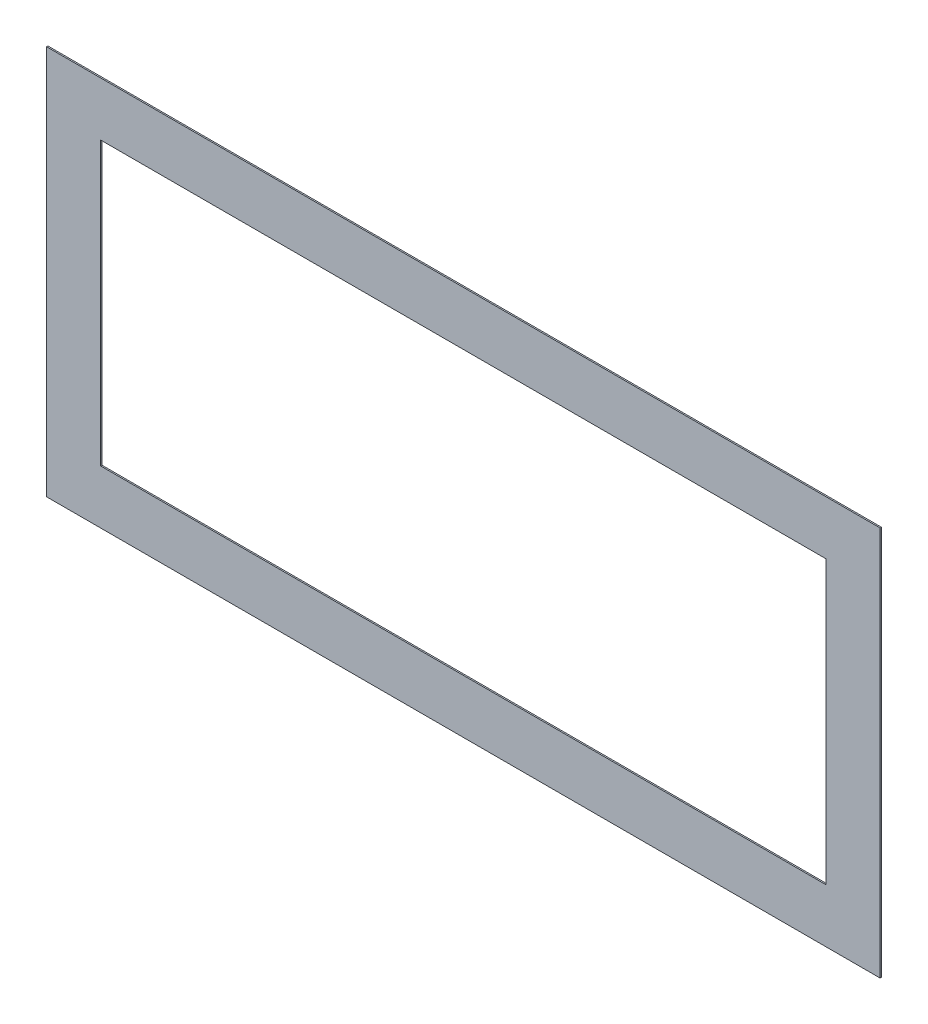
ISO-10303-21;
HEADER;
FILE_DESCRIPTION(('STEP AP214'),'2;1');
FILE_NAME('part.step','',(''),(''),'','','');
FILE_SCHEMA(('AUTOMOTIVE_DESIGN { 1 0 10303 214 1 1 1 1 }'));
ENDSEC;
DATA;
#1=APPLICATION_CONTEXT('core data for automotive mechanical design processes');
#2=APPLICATION_PROTOCOL_DEFINITION('international standard','automotive_design',2000,#1);
#3=PRODUCT_CONTEXT('',#1,'mechanical');
#4=PRODUCT('Part','Part','',(#3));
#5=PRODUCT_RELATED_PRODUCT_CATEGORY('part','',(#4));
#6=PRODUCT_DEFINITION_FORMATION('','',#4);
#7=PRODUCT_DEFINITION_CONTEXT('part definition',#1,'design');
#8=PRODUCT_DEFINITION('design','',#6,#7);
#9=PRODUCT_DEFINITION_SHAPE('','',#8);
#10=(LENGTH_UNIT() NAMED_UNIT(*) SI_UNIT(.MILLI.,.METRE.));
#11=(NAMED_UNIT(*) PLANE_ANGLE_UNIT() SI_UNIT($,.RADIAN.));
#12=(NAMED_UNIT(*) SI_UNIT($,.STERADIAN.) SOLID_ANGLE_UNIT());
#13=UNCERTAINTY_MEASURE_WITH_UNIT(LENGTH_MEASURE(1.E-05),#10,'distance_accuracy_value','');
#14=(GEOMETRIC_REPRESENTATION_CONTEXT(3) GLOBAL_UNCERTAINTY_ASSIGNED_CONTEXT((#13)) GLOBAL_UNIT_ASSIGNED_CONTEXT((#10,
#11,#12)) REPRESENTATION_CONTEXT('',''));
#15=CARTESIAN_POINT('',(0.,0.,0.));
#16=DIRECTION('',(0.,0.,1.));
#17=DIRECTION('',(1.,0.,0.));
#18=AXIS2_PLACEMENT_3D('',#15,#16,#17);
#19=CARTESIAN_POINT('',(-685.8,266.7,0.));
#20=DIRECTION('',(-1.,0.,0.));
#21=DIRECTION('',(0.,0.,1.));
#22=AXIS2_PLACEMENT_3D('',#19,#20,#21);
#23=PLANE('',#22);
#24=DIRECTION('',(0.,-1.,0.));
#25=VECTOR('',#24,1.);
#26=CARTESIAN_POINT('',(-685.8,266.7,0.));
#27=LINE('',#26,#25);
#28=CARTESIAN_POINT('',(-685.8,266.7,0.));
#29=VERTEX_POINT('',#28);
#30=CARTESIAN_POINT('',(-685.8,-266.7,0.));
#31=VERTEX_POINT('',#30);
#32=EDGE_CURVE('E34',#29,#31,#27,.T.);
#33=ORIENTED_EDGE('',*,*,#32,.F.);
#34=DIRECTION('',(0.,0.,1.));
#35=VECTOR('',#34,1.);
#36=CARTESIAN_POINT('',(-685.8,266.7,0.));
#37=LINE('',#36,#35);
#38=CARTESIAN_POINT('',(-685.8,266.7,2.54));
#39=VERTEX_POINT('',#38);
#40=EDGE_CURVE('E10',#29,#39,#37,.T.);
#41=ORIENTED_EDGE('',*,*,#40,.T.);
#42=DIRECTION('',(0.,1.,0.));
#43=VECTOR('',#42,1.);
#44=CARTESIAN_POINT('',(-685.8,-266.7,2.54));
#45=LINE('',#44,#43);
#46=CARTESIAN_POINT('',(-685.8,-266.7,2.54));
#47=VERTEX_POINT('',#46);
#48=EDGE_CURVE('E109',#47,#39,#45,.T.);
#49=ORIENTED_EDGE('',*,*,#48,.F.);
#50=DIRECTION('',(0.,0.,1.));
#51=VECTOR('',#50,1.);
#52=CARTESIAN_POINT('',(-685.8,-266.7,0.));
#53=LINE('',#52,#51);
#54=EDGE_CURVE('E114',#31,#47,#53,.T.);
#55=ORIENTED_EDGE('',*,*,#54,.F.);
#56=EDGE_LOOP('',(#33,#41,#49,#55));
#57=FACE_BOUND('',#56,.T.);
#58=ADVANCED_FACE('F16',(#57),#23,.F.);
#59=CARTESIAN_POINT('',(685.8,266.7,0.));
#60=DIRECTION('',(0.,1.,0.));
#61=DIRECTION('',(0.,0.,1.));
#62=AXIS2_PLACEMENT_3D('',#59,#60,#61);
#63=PLANE('',#62);
#64=DIRECTION('',(-1.,0.,0.));
#65=VECTOR('',#64,1.);
#66=CARTESIAN_POINT('',(685.8,266.7,0.));
#67=LINE('',#66,#65);
#68=CARTESIAN_POINT('',(685.8,266.7,0.));
#69=VERTEX_POINT('',#68);
#70=EDGE_CURVE('E172',#69,#29,#67,.T.);
#71=ORIENTED_EDGE('',*,*,#70,.F.);
#72=DIRECTION('',(0.,0.,1.));
#73=VECTOR('',#72,1.);
#74=CARTESIAN_POINT('',(685.8,266.7,0.));
#75=LINE('',#74,#73);
#76=CARTESIAN_POINT('',(685.8,266.7,2.54));
#77=VERTEX_POINT('',#76);
#78=EDGE_CURVE('E26',#69,#77,#75,.T.);
#79=ORIENTED_EDGE('',*,*,#78,.T.);
#80=DIRECTION('',(1.,0.,0.));
#81=VECTOR('',#80,1.);
#82=CARTESIAN_POINT('',(-685.8,266.7,2.54));
#83=LINE('',#82,#81);
#84=EDGE_CURVE('E176',#39,#77,#83,.T.);
#85=ORIENTED_EDGE('',*,*,#84,.F.);
#86=ORIENTED_EDGE('',*,*,#40,.F.);
#87=EDGE_LOOP('',(#71,#79,#85,#86));
#88=FACE_BOUND('',#87,.T.);
#89=ADVANCED_FACE('F146',(#88),#63,.F.);
#90=CARTESIAN_POINT('',(685.8,-266.7,0.));
#91=DIRECTION('',(1.,0.,0.));
#92=DIRECTION('',(0.,0.,-1.));
#93=AXIS2_PLACEMENT_3D('',#90,#91,#92);
#94=PLANE('',#93);
#95=DIRECTION('',(0.,1.,0.));
#96=VECTOR('',#95,1.);
#97=CARTESIAN_POINT('',(685.8,-266.7,0.));
#98=LINE('',#97,#96);
#99=CARTESIAN_POINT('',(685.8,-266.7,0.));
#100=VERTEX_POINT('',#99);
#101=EDGE_CURVE('E169',#100,#69,#98,.T.);
#102=ORIENTED_EDGE('',*,*,#101,.F.);
#103=DIRECTION('',(0.,0.,1.));
#104=VECTOR('',#103,1.);
#105=CARTESIAN_POINT('',(685.8,-266.7,0.));
#106=LINE('',#105,#104);
#107=CARTESIAN_POINT('',(685.8,-266.7,2.54));
#108=VERTEX_POINT('',#107);
#109=EDGE_CURVE('E118',#100,#108,#106,.T.);
#110=ORIENTED_EDGE('',*,*,#109,.T.);
#111=DIRECTION('',(0.,-1.,0.));
#112=VECTOR('',#111,1.);
#113=CARTESIAN_POINT('',(685.8,266.7,2.54));
#114=LINE('',#113,#112);
#115=EDGE_CURVE('E130',#77,#108,#114,.T.);
#116=ORIENTED_EDGE('',*,*,#115,.F.);
#117=ORIENTED_EDGE('',*,*,#78,.F.);
#118=EDGE_LOOP('',(#102,#110,#116,#117));
#119=FACE_BOUND('',#118,.T.);
#120=ADVANCED_FACE('F151',(#119),#94,.F.);
#121=CARTESIAN_POINT('',(-685.8,-266.7,0.));
#122=DIRECTION('',(0.,-1.,0.));
#123=DIRECTION('',(0.,0.,-1.));
#124=AXIS2_PLACEMENT_3D('',#121,#122,#123);
#125=PLANE('',#124);
#126=DIRECTION('',(1.,0.,0.));
#127=VECTOR('',#126,1.);
#128=CARTESIAN_POINT('',(-685.8,-266.7,0.));
#129=LINE('',#128,#127);
#130=EDGE_CURVE('E165',#31,#100,#129,.T.);
#131=ORIENTED_EDGE('',*,*,#130,.F.);
#132=ORIENTED_EDGE('',*,*,#54,.T.);
#133=DIRECTION('',(-1.,0.,0.));
#134=VECTOR('',#133,1.);
#135=CARTESIAN_POINT('',(685.8,-266.7,2.54));
#136=LINE('',#135,#134);
#137=EDGE_CURVE('E128',#108,#47,#136,.T.);
#138=ORIENTED_EDGE('',*,*,#137,.F.);
#139=ORIENTED_EDGE('',*,*,#109,.F.);
#140=EDGE_LOOP('',(#131,#132,#138,#139));
#141=FACE_BOUND('',#140,.T.);
#142=ADVANCED_FACE('F143',(#141),#125,.F.);
#143=CARTESIAN_POINT('',(787.400000000001,-368.3,0.));
#144=DIRECTION('',(1.,0.,0.));
#145=DIRECTION('',(0.,0.,-1.));
#146=AXIS2_PLACEMENT_3D('',#143,#144,#145);
#147=PLANE('',#146);
#148=DIRECTION('',(0.,-1.,0.));
#149=VECTOR('',#148,1.);
#150=CARTESIAN_POINT('',(787.4,368.3,0.));
#151=LINE('',#150,#149);
#152=CARTESIAN_POINT('',(787.4,368.3,0.));
#153=VERTEX_POINT('',#152);
#154=CARTESIAN_POINT('',(787.400000000001,-368.3,0.));
#155=VERTEX_POINT('',#154);
#156=EDGE_CURVE('E113',#153,#155,#151,.T.);
#157=ORIENTED_EDGE('',*,*,#156,.F.);
#158=DIRECTION('',(0.,0.,1.));
#159=VECTOR('',#158,1.);
#160=CARTESIAN_POINT('',(787.4,368.3,0.));
#161=LINE('',#160,#159);
#162=CARTESIAN_POINT('',(787.4,368.3,2.54));
#163=VERTEX_POINT('',#162);
#164=EDGE_CURVE('E111',#153,#163,#161,.T.);
#165=ORIENTED_EDGE('',*,*,#164,.T.);
#166=DIRECTION('',(0.,1.,0.));
#167=VECTOR('',#166,1.);
#168=CARTESIAN_POINT('',(787.400000000001,-368.3,2.54));
#169=LINE('',#168,#167);
#170=CARTESIAN_POINT('',(787.400000000001,-368.3,2.54));
#171=VERTEX_POINT('',#170);
#172=EDGE_CURVE('E104',#171,#163,#169,.T.);
#173=ORIENTED_EDGE('',*,*,#172,.F.);
#174=DIRECTION('',(0.,0.,1.));
#175=VECTOR('',#174,1.);
#176=CARTESIAN_POINT('',(787.400000000001,-368.3,0.));
#177=LINE('',#176,#175);
#178=EDGE_CURVE('E115',#155,#171,#177,.T.);
#179=ORIENTED_EDGE('',*,*,#178,.F.);
#180=EDGE_LOOP('',(#157,#165,#173,#179));
#181=FACE_BOUND('',#180,.T.);
#182=ADVANCED_FACE('F112',(#181),#147,.T.);
#183=CARTESIAN_POINT('',(-787.4,-368.3,0.));
#184=DIRECTION('',(0.,-1.,0.));
#185=DIRECTION('',(0.,0.,-1.));
#186=AXIS2_PLACEMENT_3D('',#183,#184,#185);
#187=PLANE('',#186);
#188=DIRECTION('',(-1.,0.,0.));
#189=VECTOR('',#188,1.);
#190=CARTESIAN_POINT('',(787.400000000001,-368.3,0.));
#191=LINE('',#190,#189);
#192=CARTESIAN_POINT('',(-787.4,-368.3,0.));
#193=VERTEX_POINT('',#192);
#194=EDGE_CURVE('E124',#155,#193,#191,.T.);
#195=ORIENTED_EDGE('',*,*,#194,.F.);
#196=ORIENTED_EDGE('',*,*,#178,.T.);
#197=DIRECTION('',(1.,0.,0.));
#198=VECTOR('',#197,1.);
#199=CARTESIAN_POINT('',(-787.4,-368.3,2.54));
#200=LINE('',#199,#198);
#201=CARTESIAN_POINT('',(-787.4,-368.3,2.54));
#202=VERTEX_POINT('',#201);
#203=EDGE_CURVE('E94',#202,#171,#200,.T.);
#204=ORIENTED_EDGE('',*,*,#203,.F.);
#205=DIRECTION('',(0.,0.,1.));
#206=VECTOR('',#205,1.);
#207=CARTESIAN_POINT('',(-787.4,-368.3,0.));
#208=LINE('',#207,#206);
#209=EDGE_CURVE('E90',#193,#202,#208,.T.);
#210=ORIENTED_EDGE('',*,*,#209,.F.);
#211=EDGE_LOOP('',(#195,#196,#204,#210));
#212=FACE_BOUND('',#211,.T.);
#213=ADVANCED_FACE('F134',(#212),#187,.T.);
#214=CARTESIAN_POINT('',(-787.4,368.3,0.));
#215=DIRECTION('',(-1.,0.,0.));
#216=DIRECTION('',(0.,0.,1.));
#217=AXIS2_PLACEMENT_3D('',#214,#215,#216);
#218=PLANE('',#217);
#219=DIRECTION('',(0.,1.,0.));
#220=VECTOR('',#219,1.);
#221=CARTESIAN_POINT('',(-787.4,-368.3,0.));
#222=LINE('',#221,#220);
#223=CARTESIAN_POINT('',(-787.4,368.3,0.));
#224=VERTEX_POINT('',#223);
#225=EDGE_CURVE('E78',#193,#224,#222,.T.);
#226=ORIENTED_EDGE('',*,*,#225,.F.);
#227=ORIENTED_EDGE('',*,*,#209,.T.);
#228=DIRECTION('',(0.,-1.,0.));
#229=VECTOR('',#228,1.);
#230=CARTESIAN_POINT('',(-787.4,368.3,2.54));
#231=LINE('',#230,#229);
#232=CARTESIAN_POINT('',(-787.4,368.3,2.54));
#233=VERTEX_POINT('',#232);
#234=EDGE_CURVE('E84',#233,#202,#231,.T.);
#235=ORIENTED_EDGE('',*,*,#234,.F.);
#236=DIRECTION('',(0.,0.,1.));
#237=VECTOR('',#236,1.);
#238=CARTESIAN_POINT('',(-787.4,368.3,0.));
#239=LINE('',#238,#237);
#240=EDGE_CURVE('E87',#224,#233,#239,.T.);
#241=ORIENTED_EDGE('',*,*,#240,.F.);
#242=EDGE_LOOP('',(#226,#227,#235,#241));
#243=FACE_BOUND('',#242,.T.);
#244=ADVANCED_FACE('F86',(#243),#218,.T.);
#245=CARTESIAN_POINT('',(787.4,368.3,0.));
#246=DIRECTION('',(0.,1.,0.));
#247=DIRECTION('',(0.,0.,1.));
#248=AXIS2_PLACEMENT_3D('',#245,#246,#247);
#249=PLANE('',#248);
#250=DIRECTION('',(1.,0.,0.));
#251=VECTOR('',#250,1.);
#252=CARTESIAN_POINT('',(-787.4,368.3,0.));
#253=LINE('',#252,#251);
#254=EDGE_CURVE('E100',#224,#153,#253,.T.);
#255=ORIENTED_EDGE('',*,*,#254,.F.);
#256=ORIENTED_EDGE('',*,*,#240,.T.);
#257=DIRECTION('',(-1.,0.,0.));
#258=VECTOR('',#257,1.);
#259=CARTESIAN_POINT('',(787.4,368.3,2.54));
#260=LINE('',#259,#258);
#261=EDGE_CURVE('E20',#163,#233,#260,.T.);
#262=ORIENTED_EDGE('',*,*,#261,.F.);
#263=ORIENTED_EDGE('',*,*,#164,.F.);
#264=EDGE_LOOP('',(#255,#256,#262,#263));
#265=FACE_BOUND('',#264,.T.);
#266=ADVANCED_FACE('F98',(#265),#249,.T.);
#267=CARTESIAN_POINT('',(2.065781492E-13,0.,2.54));
#268=DIRECTION('',(0.,0.,1.));
#269=DIRECTION('',(1.,0.,0.));
#270=AXIS2_PLACEMENT_3D('',#267,#268,#269);
#271=PLANE('',#270);
#272=ORIENTED_EDGE('',*,*,#261,.T.);
#273=ORIENTED_EDGE('',*,*,#234,.T.);
#274=ORIENTED_EDGE('',*,*,#203,.T.);
#275=ORIENTED_EDGE('',*,*,#172,.T.);
#276=EDGE_LOOP('',(#272,#273,#274,#275));
#277=FACE_BOUND('',#276,.T.);
#278=ORIENTED_EDGE('',*,*,#48,.T.);
#279=ORIENTED_EDGE('',*,*,#84,.T.);
#280=ORIENTED_EDGE('',*,*,#115,.T.);
#281=ORIENTED_EDGE('',*,*,#137,.T.);
#282=EDGE_LOOP('',(#278,#279,#280,#281));
#283=FACE_BOUND('',#282,.T.);
#284=ADVANCED_FACE('F102',(#277,#283),#271,.T.);
#285=CARTESIAN_POINT('',(2.065781492E-13,0.,0.));
#286=DIRECTION('',(0.,0.,1.));
#287=DIRECTION('',(1.,0.,0.));
#288=AXIS2_PLACEMENT_3D('',#285,#286,#287);
#289=PLANE('',#288);
#290=ORIENTED_EDGE('',*,*,#254,.T.);
#291=ORIENTED_EDGE('',*,*,#156,.T.);
#292=ORIENTED_EDGE('',*,*,#194,.T.);
#293=ORIENTED_EDGE('',*,*,#225,.T.);
#294=EDGE_LOOP('',(#290,#291,#292,#293));
#295=FACE_BOUND('',#294,.T.);
#296=ORIENTED_EDGE('',*,*,#32,.T.);
#297=ORIENTED_EDGE('',*,*,#130,.T.);
#298=ORIENTED_EDGE('',*,*,#101,.T.);
#299=ORIENTED_EDGE('',*,*,#70,.T.);
#300=EDGE_LOOP('',(#296,#297,#298,#299));
#301=FACE_BOUND('',#300,.T.);
#302=ADVANCED_FACE('F18',(#295,#301),#289,.F.);
#303=CLOSED_SHELL('',(#58,#89,#120,#142,#182,#213,#244,#266,#284,#302));
#304=MANIFOLD_SOLID_BREP('B1',#303);
#305=ADVANCED_BREP_SHAPE_REPRESENTATION('',(#18,#304),#14);
#306=SHAPE_DEFINITION_REPRESENTATION(#9,#305);
ENDSEC;
END-ISO-10303-21;
